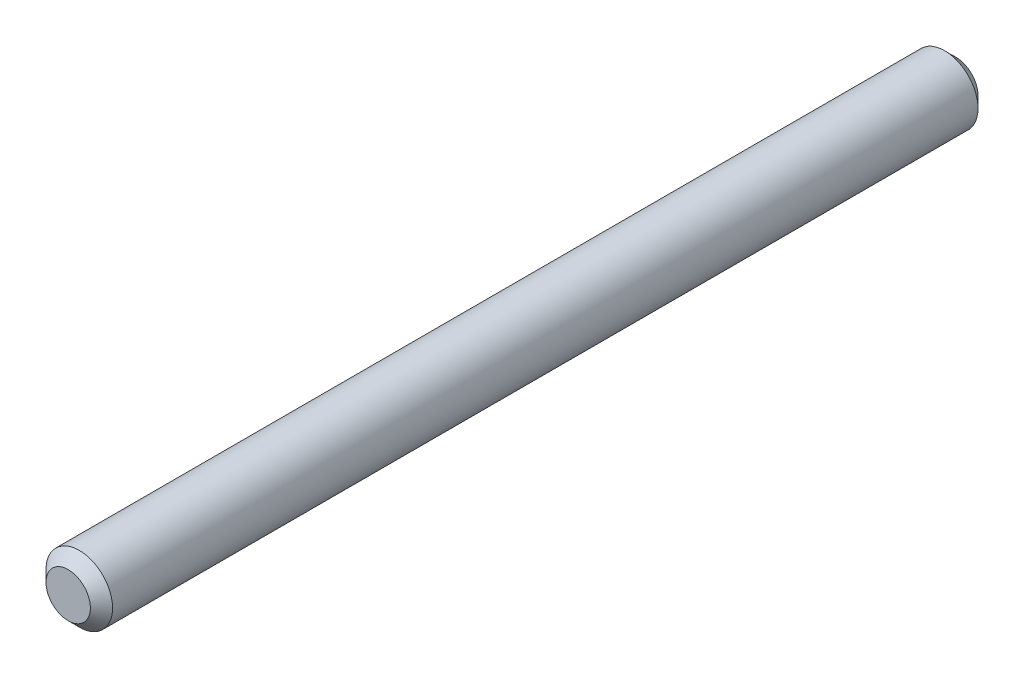
ISO-10303-21;
HEADER;
FILE_DESCRIPTION(('STEP AP214'),'2;1');
FILE_NAME('part.step','',(''),(''),'','','');
FILE_SCHEMA(('AUTOMOTIVE_DESIGN { 1 0 10303 214 1 1 1 1 }'));
ENDSEC;
DATA;
#1=APPLICATION_CONTEXT('core data for automotive mechanical design processes');
#2=APPLICATION_PROTOCOL_DEFINITION('international standard','automotive_design',2000,#1);
#3=PRODUCT_CONTEXT('',#1,'mechanical');
#4=PRODUCT('Part','Part','',(#3));
#5=PRODUCT_RELATED_PRODUCT_CATEGORY('part','',(#4));
#6=PRODUCT_DEFINITION_FORMATION('','',#4);
#7=PRODUCT_DEFINITION_CONTEXT('part definition',#1,'design');
#8=PRODUCT_DEFINITION('design','',#6,#7);
#9=PRODUCT_DEFINITION_SHAPE('','',#8);
#10=(LENGTH_UNIT() NAMED_UNIT(*) SI_UNIT(.MILLI.,.METRE.));
#11=(NAMED_UNIT(*) PLANE_ANGLE_UNIT() SI_UNIT($,.RADIAN.));
#12=(NAMED_UNIT(*) SI_UNIT($,.STERADIAN.) SOLID_ANGLE_UNIT());
#13=UNCERTAINTY_MEASURE_WITH_UNIT(LENGTH_MEASURE(1.E-05),#10,'distance_accuracy_value','');
#14=(GEOMETRIC_REPRESENTATION_CONTEXT(3) GLOBAL_UNCERTAINTY_ASSIGNED_CONTEXT((#13)) GLOBAL_UNIT_ASSIGNED_CONTEXT((#10,
#11,#12)) REPRESENTATION_CONTEXT('',''));
#15=CARTESIAN_POINT('',(0.,0.,0.));
#16=DIRECTION('',(0.,0.,1.));
#17=DIRECTION('',(1.,0.,0.));
#18=AXIS2_PLACEMENT_3D('',#15,#16,#17);
#19=CARTESIAN_POINT('',(0.,0.,80.));
#20=DIRECTION('',(0.,0.,-1.));
#21=DIRECTION('',(-1.,0.,0.));
#22=AXIS2_PLACEMENT_3D('',#19,#20,#21);
#23=CYLINDRICAL_SURFACE('',#22,3.);
#24=CARTESIAN_POINT('',(0.,0.,1.00000000000003));
#25=DIRECTION('',(0.,0.,1.));
#26=DIRECTION('',(1.,0.,0.));
#27=AXIS2_PLACEMENT_3D('',#24,#25,#26);
#28=CIRCLE('',#27,3.);
#29=CARTESIAN_POINT('',(3.,0.,1.00000000000003));
#30=VERTEX_POINT('',#29);
#31=EDGE_CURVE('E44',#30,#30,#28,.T.);
#32=ORIENTED_EDGE('',*,*,#31,.T.);
#33=EDGE_LOOP('',(#32));
#34=FACE_BOUND('',#33,.T.);
#35=CARTESIAN_POINT('',(0.,0.,79.));
#36=DIRECTION('',(0.,0.,1.));
#37=DIRECTION('',(1.,0.,0.));
#38=AXIS2_PLACEMENT_3D('',#35,#36,#37);
#39=CIRCLE('',#38,3.);
#40=CARTESIAN_POINT('',(3.,0.,79.));
#41=VERTEX_POINT('',#40);
#42=EDGE_CURVE('E48',#41,#41,#39,.F.);
#43=ORIENTED_EDGE('',*,*,#42,.T.);
#44=EDGE_LOOP('',(#43));
#45=FACE_BOUND('',#44,.T.);
#46=ADVANCED_FACE('F32',(#34,#45),#23,.T.);
#47=CARTESIAN_POINT('',(0.,0.,80.));
#48=DIRECTION('',(0.,0.,1.));
#49=DIRECTION('',(1.,0.,0.));
#50=AXIS2_PLACEMENT_3D('',#47,#48,#49);
#51=PLANE('',#50);
#52=CARTESIAN_POINT('',(0.,0.,80.));
#53=DIRECTION('',(0.,0.,1.));
#54=DIRECTION('',(1.,0.,0.));
#55=AXIS2_PLACEMENT_3D('',#52,#53,#54);
#56=CIRCLE('',#55,1.99999999999999);
#57=CARTESIAN_POINT('',(1.99999999999999,0.,80.));
#58=VERTEX_POINT('',#57);
#59=EDGE_CURVE('E10',#58,#58,#56,.T.);
#60=ORIENTED_EDGE('',*,*,#59,.T.);
#61=EDGE_LOOP('',(#60));
#62=FACE_BOUND('',#61,.T.);
#63=ADVANCED_FACE('F64',(#62),#51,.T.);
#64=CARTESIAN_POINT('',(0.,0.,0.));
#65=DIRECTION('',(0.,0.,1.));
#66=DIRECTION('',(1.,0.,0.));
#67=AXIS2_PLACEMENT_3D('',#64,#65,#66);
#68=PLANE('',#67);
#69=CARTESIAN_POINT('',(0.,0.,0.));
#70=DIRECTION('',(0.,0.,1.));
#71=DIRECTION('',(1.,0.,0.));
#72=AXIS2_PLACEMENT_3D('',#69,#70,#71);
#73=CIRCLE('',#72,1.99999999999998);
#74=CARTESIAN_POINT('',(1.99999999999998,0.,0.));
#75=VERTEX_POINT('',#74);
#76=EDGE_CURVE('E40',#75,#75,#73,.F.);
#77=ORIENTED_EDGE('',*,*,#76,.T.);
#78=EDGE_LOOP('',(#77));
#79=FACE_BOUND('',#78,.T.);
#80=ADVANCED_FACE('F61',(#79),#68,.F.);
#81=CARTESIAN_POINT('',(0.,0.,1.00000000000003));
#82=DIRECTION('',(0.,0.,1.));
#83=DIRECTION('',(1.,0.,0.));
#84=AXIS2_PLACEMENT_3D('',#81,#82,#83);
#85=CONICAL_SURFACE('',#84,3.,0.785398163397444);
#86=ORIENTED_EDGE('',*,*,#76,.F.);
#87=EDGE_LOOP('',(#86));
#88=FACE_BOUND('',#87,.T.);
#89=ORIENTED_EDGE('',*,*,#31,.F.);
#90=EDGE_LOOP('',(#89));
#91=FACE_BOUND('',#90,.T.);
#92=ADVANCED_FACE('F57',(#88,#91),#85,.T.);
#93=CARTESIAN_POINT('',(0.,0.,80.));
#94=DIRECTION('',(0.,0.,-1.));
#95=DIRECTION('',(-1.,0.,0.));
#96=AXIS2_PLACEMENT_3D('',#93,#94,#95);
#97=CONICAL_SURFACE('',#96,1.99999999999999,0.785398163397444);
#98=ORIENTED_EDGE('',*,*,#42,.F.);
#99=EDGE_LOOP('',(#98));
#100=FACE_BOUND('',#99,.T.);
#101=ORIENTED_EDGE('',*,*,#59,.F.);
#102=EDGE_LOOP('',(#101));
#103=FACE_BOUND('',#102,.T.);
#104=ADVANCED_FACE('F35',(#100,#103),#97,.T.);
#105=CLOSED_SHELL('',(#46,#63,#80,#92,#104));
#106=MANIFOLD_SOLID_BREP('B2',#105);
#107=ADVANCED_BREP_SHAPE_REPRESENTATION('',(#18,#106),#14);
#108=SHAPE_DEFINITION_REPRESENTATION(#9,#107);
ENDSEC;
END-ISO-10303-21;
